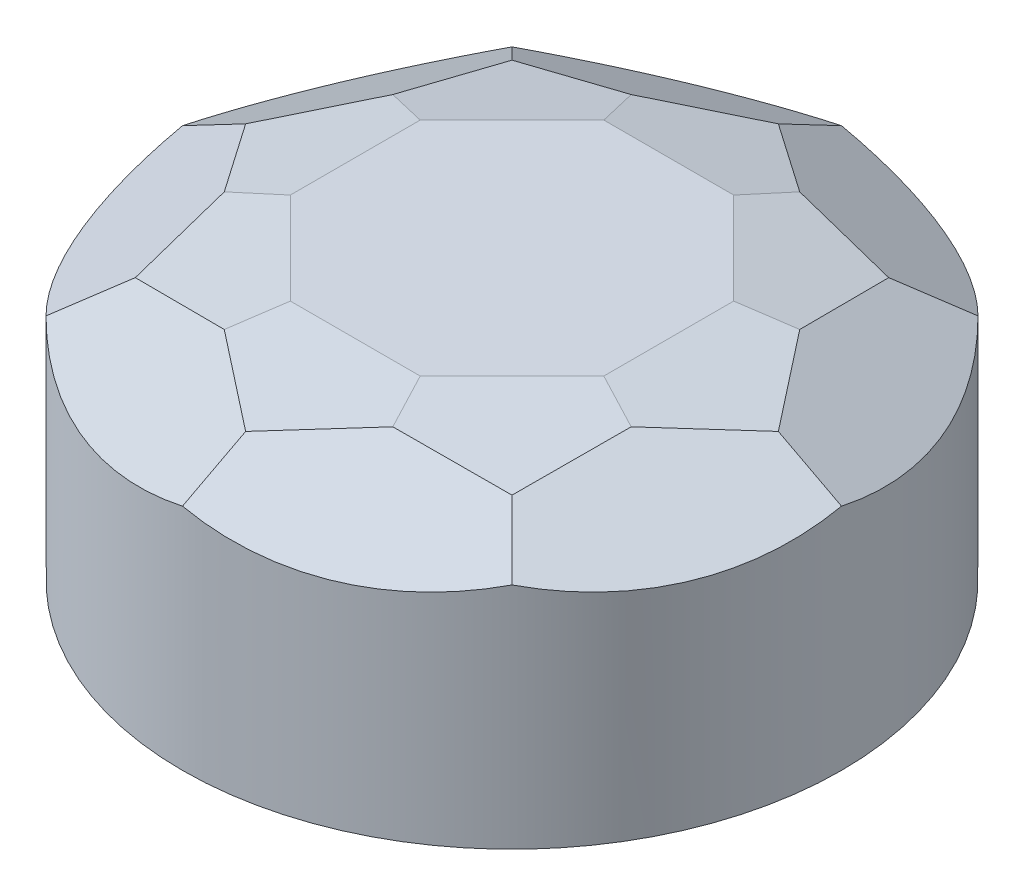
ISO-10303-21;
HEADER;
FILE_DESCRIPTION(('STEP AP214'),'2;1');
FILE_NAME('part.step','',(''),(''),'','','');
FILE_SCHEMA(('AUTOMOTIVE_DESIGN { 1 0 10303 214 1 1 1 1 }'));
ENDSEC;
DATA;
#1=APPLICATION_CONTEXT('core data for automotive mechanical design processes');
#2=APPLICATION_PROTOCOL_DEFINITION('international standard','automotive_design',2000,#1);
#3=PRODUCT_CONTEXT('',#1,'mechanical');
#4=PRODUCT('Part','Part','',(#3));
#5=PRODUCT_RELATED_PRODUCT_CATEGORY('part','',(#4));
#6=PRODUCT_DEFINITION_FORMATION('','',#4);
#7=PRODUCT_DEFINITION_CONTEXT('part definition',#1,'design');
#8=PRODUCT_DEFINITION('design','',#6,#7);
#9=PRODUCT_DEFINITION_SHAPE('','',#8);
#10=(LENGTH_UNIT() NAMED_UNIT(*) SI_UNIT(.MILLI.,.METRE.));
#11=(NAMED_UNIT(*) PLANE_ANGLE_UNIT() SI_UNIT($,.RADIAN.));
#12=(NAMED_UNIT(*) SI_UNIT($,.STERADIAN.) SOLID_ANGLE_UNIT());
#13=UNCERTAINTY_MEASURE_WITH_UNIT(LENGTH_MEASURE(1.E-05),#10,'distance_accuracy_value','');
#14=(GEOMETRIC_REPRESENTATION_CONTEXT(3) GLOBAL_UNCERTAINTY_ASSIGNED_CONTEXT((#13)) GLOBAL_UNIT_ASSIGNED_CONTEXT((#10,
#11,#12)) REPRESENTATION_CONTEXT('',''));
#15=CARTESIAN_POINT('',(0.,0.,0.));
#16=DIRECTION('',(0.,0.,1.));
#17=DIRECTION('',(1.,0.,0.));
#18=AXIS2_PLACEMENT_3D('',#15,#16,#17);
#19=CARTESIAN_POINT('',(2.55613981266696,2.5,0.));
#20=DIRECTION('',(-0.456405180558468,-0.869456557392768,0.189049215724658));
#21=DIRECTION('',(-0.382683432365089,0.,-0.923879532511287));
#22=AXIS2_PLACEMENT_3D('',#19,#20,#21);
#23=PLANE('',#22);
#24=CARTESIAN_POINT('',(0.,3.84179844043195,0.));
#25=DIRECTION('',(-0.456405180558468,-0.869456557392768,0.189049215724658));
#26=DIRECTION('',(0.803273117782904,-0.494009407609528,-0.332726619675399));
#27=AXIS2_PLACEMENT_3D('',#24,#25,#26);
#28=ELLIPSE('',#27,3.62295272054291,3.15);
#29=CARTESIAN_POINT('',(2.22738636073762,2.18826404985777,-2.22738636073763));
#30=VERTEX_POINT('',#29);
#31=CARTESIAN_POINT('',(3.15,2.18826404985777,0.));
#32=VERTEX_POINT('',#31);
#33=EDGE_CURVE('E106',#30,#32,#28,.T.);
#34=ORIENTED_EDGE('',*,*,#33,.F.);
#35=DIRECTION('',(0.626088497425685,-0.464786388336079,-0.626088497425685));
#36=VECTOR('',#35,1.);
#37=CARTESIAN_POINT('',(1.80746379519772,2.5,-1.80746379519772));
#38=LINE('',#37,#36);
#39=CARTESIAN_POINT('',(1.80055051986738,2.50513217585943,-1.80055051986739));
#40=VERTEX_POINT('',#39);
#41=EDGE_CURVE('E186',#40,#30,#38,.T.);
#42=ORIENTED_EDGE('',*,*,#41,.F.);
#43=DIRECTION('',(0.14228490267572,0.138416972490149,0.980099866440773));
#44=VECTOR('',#43,1.);
#45=CARTESIAN_POINT('',(2.05207874902967,2.74982276018517,-0.0679507909285371));
#46=LINE('',#45,#44);
#47=CARTESIAN_POINT('',(1.9449856260838,2.64564089988994,-0.805639424944661));
#48=VERTEX_POINT('',#47);
#49=EDGE_CURVE('E189',#40,#48,#46,.T.);
#50=ORIENTED_EDGE('',*,*,#49,.T.);
#51=DIRECTION('',(0.592424642257822,-0.138416972490143,0.793645881342778));
#52=VECTOR('',#51,1.);
#53=CARTESIAN_POINT('',(2.55119969783468,2.50400209807899,0.00647956359621975));
#54=LINE('',#53,#52);
#55=CARTESIAN_POINT('',(2.54636296493438,2.50513217585944,0.));
#56=VERTEX_POINT('',#55);
#57=EDGE_CURVE('E182',#48,#56,#54,.T.);
#58=ORIENTED_EDGE('',*,*,#57,.T.);
#59=DIRECTION('',(0.885422844305196,-0.464786388336079,0.));
#60=VECTOR('',#59,1.);
#61=CARTESIAN_POINT('',(2.55613981266696,2.5,0.));
#62=LINE('',#61,#60);
#63=EDGE_CURVE('E183',#32,#56,#62,.F.);
#64=ORIENTED_EDGE('',*,*,#63,.F.);
#65=EDGE_LOOP('',(#34,#42,#50,#58,#64));
#66=FACE_BOUND('',#65,.T.);
#67=ADVANCED_FACE('F34',(#66),#23,.F.);
#68=CARTESIAN_POINT('',(1.80746379519772,2.5,-1.80746379519772));
#69=DIRECTION('',(-0.189049215724659,-0.869456557392768,0.456405180558468));
#70=DIRECTION('',(-0.923879532511287,0.,-0.38268343236509));
#71=AXIS2_PLACEMENT_3D('',#68,#69,#70);
#72=PLANE('',#71);
#73=CARTESIAN_POINT('',(0.,3.84179844043195,0.));
#74=DIRECTION('',(-0.189049215724659,-0.869456557392768,0.456405180558468));
#75=DIRECTION('',(0.332726619675399,-0.494009407609527,-0.803273117782904));
#76=AXIS2_PLACEMENT_3D('',#73,#74,#75);
#77=ELLIPSE('',#76,3.62295272054291,3.15);
#78=CARTESIAN_POINT('',(0.,2.18826404985777,-3.15));
#79=VERTEX_POINT('',#78);
#80=EDGE_CURVE('E217',#79,#30,#77,.T.);
#81=ORIENTED_EDGE('',*,*,#80,.F.);
#82=DIRECTION('',(0.,-0.464786388336079,-0.885422844305196));
#83=VECTOR('',#82,1.);
#84=CARTESIAN_POINT('',(0.,2.5,-2.55613981266696));
#85=LINE('',#84,#83);
#86=CARTESIAN_POINT('',(0.,2.50513217585944,-2.54636296493438));
#87=VERTEX_POINT('',#86);
#88=EDGE_CURVE('E176',#87,#79,#85,.T.);
#89=ORIENTED_EDGE('',*,*,#88,.F.);
#90=DIRECTION('',(0.793645881342772,0.138416972490148,0.592424642257829));
#91=VECTOR('',#90,1.);
#92=CARTESIAN_POINT('',(1.40299033391513,2.74982276018517,-1.49908726402025));
#93=LINE('',#92,#91);
#94=CARTESIAN_POINT('',(0.80563942494462,2.64564089988994,-1.94498562608382));
#95=VERTEX_POINT('',#94);
#96=EDGE_CURVE('E197',#87,#95,#93,.T.);
#97=ORIENTED_EDGE('',*,*,#96,.T.);
#98=DIRECTION('',(0.980099866440773,-0.138416972490143,0.142284902675732));
#99=VECTOR('',#98,1.);
#100=CARTESIAN_POINT('',(1.80855234985799,2.50400209807899,-1.79938886314196));
#101=LINE('',#100,#99);
#102=EDGE_CURVE('E192',#95,#40,#101,.T.);
#103=ORIENTED_EDGE('',*,*,#102,.T.);
#104=ORIENTED_EDGE('',*,*,#41,.T.);
#105=EDGE_LOOP('',(#81,#89,#97,#103,#104));
#106=FACE_BOUND('',#105,.T.);
#107=ADVANCED_FACE('F330',(#106),#72,.F.);
#108=CARTESIAN_POINT('',(1.80746379519772,2.5,1.80746379519772));
#109=DIRECTION('',(-0.456405180558467,-0.869456557392768,-0.189049215724659));
#110=DIRECTION('',(0.38268343236509,0.,-0.923879532511287));
#111=AXIS2_PLACEMENT_3D('',#108,#109,#110);
#112=PLANE('',#111);
#113=CARTESIAN_POINT('',(0.,3.84179844043195,0.));
#114=DIRECTION('',(-0.456405180558467,-0.869456557392768,-0.189049215724659));
#115=DIRECTION('',(0.803273117782904,-0.494009407609527,0.332726619675399));
#116=AXIS2_PLACEMENT_3D('',#113,#114,#115);
#117=ELLIPSE('',#116,3.62295272054291,3.15);
#118=CARTESIAN_POINT('',(2.22738636073762,2.18826404985777,2.22738636073763));
#119=VERTEX_POINT('',#118);
#120=EDGE_CURVE('E220',#32,#119,#117,.T.);
#121=ORIENTED_EDGE('',*,*,#120,.F.);
#122=ORIENTED_EDGE('',*,*,#63,.T.);
#123=DIRECTION('',(-0.59242464225783,0.138416972490149,0.793645881342771));
#124=VECTOR('',#123,1.);
#125=CARTESIAN_POINT('',(1.49908726402025,2.74982276018517,1.40299033391513));
#126=LINE('',#125,#124);
#127=CARTESIAN_POINT('',(1.94498562608382,2.64564089988994,0.805639424944625));
#128=VERTEX_POINT('',#127);
#129=EDGE_CURVE('E179',#56,#128,#126,.T.);
#130=ORIENTED_EDGE('',*,*,#129,.T.);
#131=DIRECTION('',(-0.14228490267573,-0.138416972490144,0.980099866440773));
#132=VECTOR('',#131,1.);
#133=CARTESIAN_POINT('',(1.79938886314196,2.50400209807899,1.80855234985799));
#134=LINE('',#133,#132);
#135=CARTESIAN_POINT('',(1.80055051986738,2.50513217585944,1.80055051986738));
#136=VERTEX_POINT('',#135);
#137=EDGE_CURVE('E172',#128,#136,#134,.T.);
#138=ORIENTED_EDGE('',*,*,#137,.T.);
#139=DIRECTION('',(0.626088497425686,-0.464786388336079,0.626088497425684));
#140=VECTOR('',#139,1.);
#141=CARTESIAN_POINT('',(1.80746379519772,2.5,1.80746379519772));
#142=LINE('',#141,#140);
#143=EDGE_CURVE('E173',#119,#136,#142,.F.);
#144=ORIENTED_EDGE('',*,*,#143,.F.);
#145=EDGE_LOOP('',(#121,#122,#130,#138,#144));
#146=FACE_BOUND('',#145,.T.);
#147=ADVANCED_FACE('F254',(#146),#112,.F.);
#148=CARTESIAN_POINT('',(0.,2.5,-2.55613981266696));
#149=DIRECTION('',(0.189049215724659,-0.869456557392768,0.456405180558468));
#150=DIRECTION('',(-0.923879532511287,0.,0.382683432365089));
#151=AXIS2_PLACEMENT_3D('',#148,#149,#150);
#152=PLANE('',#151);
#153=CARTESIAN_POINT('',(0.,3.84179844043195,0.));
#154=DIRECTION('',(0.189049215724659,-0.869456557392768,0.456405180558468));
#155=DIRECTION('',(-0.332726619675399,-0.494009407609527,-0.803273117782903));
#156=AXIS2_PLACEMENT_3D('',#153,#154,#155);
#157=ELLIPSE('',#156,3.62295272054291,3.15);
#158=CARTESIAN_POINT('',(-2.22738636073763,2.18826404985777,-2.22738636073763));
#159=VERTEX_POINT('',#158);
#160=EDGE_CURVE('E223',#159,#79,#157,.T.);
#161=ORIENTED_EDGE('',*,*,#160,.F.);
#162=DIRECTION('',(-0.626088497425686,-0.464786388336079,-0.626088497425685));
#163=VECTOR('',#162,1.);
#164=CARTESIAN_POINT('',(-1.80746379519772,2.5,-1.80746379519772));
#165=LINE('',#164,#163);
#166=CARTESIAN_POINT('',(-1.80055051986738,2.50513217585943,-1.80055051986739));
#167=VERTEX_POINT('',#166);
#168=EDGE_CURVE('E167',#167,#159,#165,.T.);
#169=ORIENTED_EDGE('',*,*,#168,.F.);
#170=DIRECTION('',(0.980099866440773,0.138416972490147,-0.142284902675725));
#171=VECTOR('',#170,1.);
#172=CARTESIAN_POINT('',(-0.067950790928532,2.74982276018517,-2.05207874902968));
#173=LINE('',#172,#171);
#174=CARTESIAN_POINT('',(-0.805639424944643,2.64564089988994,-1.94498562608382));
#175=VERTEX_POINT('',#174);
#176=EDGE_CURVE('E205',#167,#175,#173,.T.);
#177=ORIENTED_EDGE('',*,*,#176,.T.);
#178=DIRECTION('',(0.793645881342776,-0.138416972490144,-0.592424642257824));
#179=VECTOR('',#178,1.);
#180=CARTESIAN_POINT('',(0.00647956359622009,2.50400209807899,-2.55119969783468));
#181=LINE('',#180,#179);
#182=EDGE_CURVE('E200',#175,#87,#181,.T.);
#183=ORIENTED_EDGE('',*,*,#182,.T.);
#184=ORIENTED_EDGE('',*,*,#88,.T.);
#185=EDGE_LOOP('',(#161,#169,#177,#183,#184));
#186=FACE_BOUND('',#185,.T.);
#187=ADVANCED_FACE('F341',(#186),#152,.F.);
#188=CARTESIAN_POINT('',(0.,2.5,2.55613981266696));
#189=DIRECTION('',(-0.189049215724658,-0.869456557392768,-0.456405180558468));
#190=DIRECTION('',(0.923879532511287,0.,-0.38268343236509));
#191=AXIS2_PLACEMENT_3D('',#188,#189,#190);
#192=PLANE('',#191);
#193=CARTESIAN_POINT('',(0.,3.84179844043195,0.));
#194=DIRECTION('',(-0.189049215724658,-0.869456557392768,-0.456405180558468));
#195=DIRECTION('',(0.332726619675399,-0.494009407609527,0.803273117782903));
#196=AXIS2_PLACEMENT_3D('',#193,#194,#195);
#197=ELLIPSE('',#196,3.62295272054291,3.15);
#198=CARTESIAN_POINT('',(0.,2.18826404985777,3.15));
#199=VERTEX_POINT('',#198);
#200=EDGE_CURVE('E226',#119,#199,#197,.T.);
#201=ORIENTED_EDGE('',*,*,#200,.F.);
#202=ORIENTED_EDGE('',*,*,#143,.T.);
#203=DIRECTION('',(-0.980099866440773,0.138416972490148,0.142284902675722));
#204=VECTOR('',#203,1.);
#205=CARTESIAN_POINT('',(0.0679507909285356,2.74982276018517,2.05207874902968));
#206=LINE('',#205,#204);
#207=CARTESIAN_POINT('',(0.805639424944655,2.64564089988994,1.94498562608381));
#208=VERTEX_POINT('',#207);
#209=EDGE_CURVE('E155',#136,#208,#206,.T.);
#210=ORIENTED_EDGE('',*,*,#209,.T.);
#211=DIRECTION('',(-0.793645881342776,-0.138416972490145,0.592424642257824));
#212=VECTOR('',#211,1.);
#213=CARTESIAN_POINT('',(-0.00647956359621847,2.50400209807899,2.55119969783468));
#214=LINE('',#213,#212);
#215=CARTESIAN_POINT('',(0.,2.50513217585943,2.54636296493438));
#216=VERTEX_POINT('',#215);
#217=EDGE_CURVE('E164',#208,#216,#214,.T.);
#218=ORIENTED_EDGE('',*,*,#217,.T.);
#219=DIRECTION('',(0.,-0.464786388336079,0.885422844305196));
#220=VECTOR('',#219,1.);
#221=CARTESIAN_POINT('',(0.,2.5,2.55613981266696));
#222=LINE('',#221,#220);
#223=EDGE_CURVE('E165',#199,#216,#222,.F.);
#224=ORIENTED_EDGE('',*,*,#223,.F.);
#225=EDGE_LOOP('',(#201,#202,#210,#218,#224));
#226=FACE_BOUND('',#225,.T.);
#227=ADVANCED_FACE('F279',(#226),#192,.F.);
#228=CARTESIAN_POINT('',(-1.80746379519772,2.5,-1.80746379519772));
#229=DIRECTION('',(0.456405180558468,-0.869456557392768,0.189049215724658));
#230=DIRECTION('',(-0.38268343236509,0.,0.923879532511287));
#231=AXIS2_PLACEMENT_3D('',#228,#229,#230);
#232=PLANE('',#231);
#233=CARTESIAN_POINT('',(0.,3.84179844043195,0.));
#234=DIRECTION('',(0.456405180558468,-0.869456557392768,0.189049215724658));
#235=DIRECTION('',(-0.803273117782904,-0.494009407609527,-0.332726619675399));
#236=AXIS2_PLACEMENT_3D('',#233,#234,#235);
#237=ELLIPSE('',#236,3.62295272054291,3.15);
#238=CARTESIAN_POINT('',(-3.15,2.18826404985777,0.));
#239=VERTEX_POINT('',#238);
#240=EDGE_CURVE('E228',#239,#159,#237,.T.);
#241=ORIENTED_EDGE('',*,*,#240,.F.);
#242=DIRECTION('',(-0.885422844305196,-0.464786388336079,0.));
#243=VECTOR('',#242,1.);
#244=CARTESIAN_POINT('',(-2.55613981266696,2.5,0.));
#245=LINE('',#244,#243);
#246=CARTESIAN_POINT('',(-2.54636296493438,2.50513217585943,0.));
#247=VERTEX_POINT('',#246);
#248=EDGE_CURVE('E159',#247,#239,#245,.T.);
#249=ORIENTED_EDGE('',*,*,#248,.F.);
#250=DIRECTION('',(0.592424642257827,0.138416972490147,-0.793645881342773));
#251=VECTOR('',#250,1.);
#252=CARTESIAN_POINT('',(-1.49908726402025,2.74982276018517,-1.40299033391514));
#253=LINE('',#252,#251);
#254=CARTESIAN_POINT('',(-1.94498562608382,2.64564089988994,-0.805639424944638));
#255=VERTEX_POINT('',#254);
#256=EDGE_CURVE('E154',#247,#255,#253,.T.);
#257=ORIENTED_EDGE('',*,*,#256,.T.);
#258=DIRECTION('',(0.142284902675726,-0.138416972490146,-0.980099866440773));
#259=VECTOR('',#258,1.);
#260=CARTESIAN_POINT('',(-1.79938886314196,2.50400209807899,-1.80855234985799));
#261=LINE('',#260,#259);
#262=EDGE_CURVE('E102',#255,#167,#261,.T.);
#263=ORIENTED_EDGE('',*,*,#262,.T.);
#264=ORIENTED_EDGE('',*,*,#168,.T.);
#265=EDGE_LOOP('',(#241,#249,#257,#263,#264));
#266=FACE_BOUND('',#265,.T.);
#267=ADVANCED_FACE('F309',(#266),#232,.F.);
#268=CARTESIAN_POINT('',(-1.80746379519772,2.5,1.80746379519772));
#269=DIRECTION('',(0.189049215724659,-0.869456557392768,-0.456405180558468));
#270=DIRECTION('',(0.923879532511287,0.,0.38268343236509));
#271=AXIS2_PLACEMENT_3D('',#268,#269,#270);
#272=PLANE('',#271);
#273=CARTESIAN_POINT('',(0.,3.84179844043195,0.));
#274=DIRECTION('',(0.189049215724659,-0.869456557392768,-0.456405180558468));
#275=DIRECTION('',(-0.332726619675399,-0.494009407609527,0.803273117782903));
#276=AXIS2_PLACEMENT_3D('',#273,#274,#275);
#277=ELLIPSE('',#276,3.62295272054291,3.15);
#278=CARTESIAN_POINT('',(-2.22738636073763,2.18826404985777,2.22738636073762));
#279=VERTEX_POINT('',#278);
#280=EDGE_CURVE('E48',#199,#279,#277,.T.);
#281=ORIENTED_EDGE('',*,*,#280,.F.);
#282=ORIENTED_EDGE('',*,*,#223,.T.);
#283=DIRECTION('',(-0.793645881342772,0.138416972490148,-0.592424642257829));
#284=VECTOR('',#283,1.);
#285=CARTESIAN_POINT('',(-1.40299033391514,2.74982276018517,1.49908726402025));
#286=LINE('',#285,#284);
#287=CARTESIAN_POINT('',(-0.805639424944632,2.64564089988994,1.94498562608382));
#288=VERTEX_POINT('',#287);
#289=EDGE_CURVE('E161',#216,#288,#286,.T.);
#290=ORIENTED_EDGE('',*,*,#289,.T.);
#291=DIRECTION('',(-0.980099866440773,-0.138416972490145,-0.142284902675729));
#292=VECTOR('',#291,1.);
#293=CARTESIAN_POINT('',(-1.80855234985799,2.50400209807899,1.79938886314196));
#294=LINE('',#293,#292);
#295=CARTESIAN_POINT('',(-1.80055051986738,2.50513217585944,1.80055051986738));
#296=VERTEX_POINT('',#295);
#297=EDGE_CURVE('E157',#288,#296,#294,.T.);
#298=ORIENTED_EDGE('',*,*,#297,.T.);
#299=DIRECTION('',(0.626088497425685,0.464786388336079,-0.626088497425685));
#300=VECTOR('',#299,1.);
#301=CARTESIAN_POINT('',(-1.55563678964256,2.68694763580346,1.55563678964256));
#302=LINE('',#301,#300);
#303=EDGE_CURVE('E56',#279,#296,#302,.T.);
#304=ORIENTED_EDGE('',*,*,#303,.F.);
#305=EDGE_LOOP('',(#281,#282,#290,#298,#304));
#306=FACE_BOUND('',#305,.T.);
#307=ADVANCED_FACE('F320',(#306),#272,.F.);
#308=CARTESIAN_POINT('',(-2.55613981266696,2.5,0.));
#309=DIRECTION('',(0.456405180558468,-0.869456557392768,-0.189049215724659));
#310=DIRECTION('',(0.38268343236509,0.,0.923879532511287));
#311=AXIS2_PLACEMENT_3D('',#308,#309,#310);
#312=PLANE('',#311);
#313=CARTESIAN_POINT('',(0.,3.84179844043195,0.));
#314=DIRECTION('',(0.456405180558468,-0.869456557392768,-0.189049215724659));
#315=DIRECTION('',(-0.803273117782903,-0.494009407609527,0.332726619675399));
#316=AXIS2_PLACEMENT_3D('',#313,#314,#315);
#317=ELLIPSE('',#316,3.62295272054291,3.15);
#318=EDGE_CURVE('E11',#279,#239,#317,.T.);
#319=ORIENTED_EDGE('',*,*,#318,.F.);
#320=ORIENTED_EDGE('',*,*,#303,.T.);
#321=DIRECTION('',(-0.142284902675724,0.138416972490147,-0.980099866440773));
#322=VECTOR('',#321,1.);
#323=CARTESIAN_POINT('',(-2.05207874902968,2.74982276018517,0.0679507909285343));
#324=LINE('',#323,#322);
#325=CARTESIAN_POINT('',(-1.94498562608381,2.64564089988994,0.805639424944648));
#326=VERTEX_POINT('',#325);
#327=EDGE_CURVE('E42',#296,#326,#324,.T.);
#328=ORIENTED_EDGE('',*,*,#327,.T.);
#329=DIRECTION('',(-0.592424642257825,-0.138416972490145,-0.793645881342775));
#330=VECTOR('',#329,1.);
#331=CARTESIAN_POINT('',(-2.55119969783468,2.50400209807899,-0.00647956359621741));
#332=LINE('',#331,#330);
#333=EDGE_CURVE('E151',#326,#247,#332,.T.);
#334=ORIENTED_EDGE('',*,*,#333,.T.);
#335=ORIENTED_EDGE('',*,*,#248,.T.);
#336=EDGE_LOOP('',(#319,#320,#328,#334,#335));
#337=FACE_BOUND('',#336,.T.);
#338=ADVANCED_FACE('F310',(#337),#312,.F.);
#339=CARTESIAN_POINT('',(0.,2.75,0.));
#340=DIRECTION('',(0.,1.,0.));
#341=DIRECTION('',(0.,0.,1.));
#342=AXIS2_PLACEMENT_3D('',#339,#340,#341);
#343=PLANE('',#342);
#344=DIRECTION('',(-1.,0.,0.));
#345=VECTOR('',#344,1.);
#346=CARTESIAN_POINT('',(0.620628059159733,2.75,-1.49832867761277));
#347=LINE('',#346,#345);
#348=CARTESIAN_POINT('',(0.620628059159733,2.75,-1.49832867761277));
#349=VERTEX_POINT('',#348);
#350=CARTESIAN_POINT('',(-0.620628059159751,2.75,-1.49832867761276));
#351=VERTEX_POINT('',#350);
#352=EDGE_CURVE('E119',#349,#351,#347,.T.);
#353=ORIENTED_EDGE('',*,*,#352,.T.);
#354=DIRECTION('',(-0.707106781186547,0.,0.707106781186548));
#355=VECTOR('',#354,1.);
#356=CARTESIAN_POINT('',(-0.620628059159751,2.75,-1.49832867761276));
#357=LINE('',#356,#355);
#358=CARTESIAN_POINT('',(-1.49832867761276,2.75,-0.620628059159749));
#359=VERTEX_POINT('',#358);
#360=EDGE_CURVE('E99',#351,#359,#357,.T.);
#361=ORIENTED_EDGE('',*,*,#360,.T.);
#362=DIRECTION('',(0.,0.,1.));
#363=VECTOR('',#362,1.);
#364=CARTESIAN_POINT('',(-1.49832867761276,2.75,-0.620628059159749));
#365=LINE('',#364,#363);
#366=CARTESIAN_POINT('',(-1.49832867761276,2.75,0.620628059159756));
#367=VERTEX_POINT('',#366);
#368=EDGE_CURVE('E108',#359,#367,#365,.T.);
#369=ORIENTED_EDGE('',*,*,#368,.T.);
#370=DIRECTION('',(0.70710678118655,0.,0.707106781186545));
#371=VECTOR('',#370,1.);
#372=CARTESIAN_POINT('',(-1.49832867761276,2.75,0.620628059159756));
#373=LINE('',#372,#371);
#374=CARTESIAN_POINT('',(-0.620628059159744,2.75,1.49832867761277));
#375=VERTEX_POINT('',#374);
#376=EDGE_CURVE('E115',#367,#375,#373,.T.);
#377=ORIENTED_EDGE('',*,*,#376,.T.);
#378=DIRECTION('',(1.,0.,0.));
#379=VECTOR('',#378,1.);
#380=CARTESIAN_POINT('',(-0.620628059159744,2.75,1.49832867761277));
#381=LINE('',#380,#379);
#382=CARTESIAN_POINT('',(0.620628059159761,2.75,1.49832867761276));
#383=VERTEX_POINT('',#382);
#384=EDGE_CURVE('E126',#375,#383,#381,.T.);
#385=ORIENTED_EDGE('',*,*,#384,.T.);
#386=DIRECTION('',(0.707106781186542,0.,-0.707106781186553));
#387=VECTOR('',#386,1.);
#388=CARTESIAN_POINT('',(0.620628059159761,2.75,1.49832867761276));
#389=LINE('',#388,#387);
#390=CARTESIAN_POINT('',(1.49832867761277,2.75,0.620628059159739));
#391=VERTEX_POINT('',#390);
#392=EDGE_CURVE('E128',#383,#391,#389,.T.);
#393=ORIENTED_EDGE('',*,*,#392,.T.);
#394=DIRECTION('',(0.,0.,-1.));
#395=VECTOR('',#394,1.);
#396=CARTESIAN_POINT('',(1.49832867761277,2.75,0.620628059159739));
#397=LINE('',#396,#395);
#398=CARTESIAN_POINT('',(1.49832867761276,2.75,-0.620628059159767));
#399=VERTEX_POINT('',#398);
#400=EDGE_CURVE('E130',#391,#399,#397,.T.);
#401=ORIENTED_EDGE('',*,*,#400,.T.);
#402=DIRECTION('',(-0.707106781186555,0.,-0.70710678118654));
#403=VECTOR('',#402,1.);
#404=CARTESIAN_POINT('',(1.49832867761276,2.75,-0.620628059159767));
#405=LINE('',#404,#403);
#406=EDGE_CURVE('E132',#399,#349,#405,.T.);
#407=ORIENTED_EDGE('',*,*,#406,.T.);
#408=EDGE_LOOP('',(#353,#361,#369,#377,#385,#393,#401,#407));
#409=FACE_BOUND('',#408,.T.);
#410=ADVANCED_FACE('F117',(#409),#343,.T.);
#411=CARTESIAN_POINT('',(0.620628059159761,2.75,1.49832867761276));
#412=DIRECTION('',(-0.160879024817218,-0.973774038854868,-0.160879024817216));
#413=DIRECTION('',(0.707106781186542,0.,-0.707106781186553));
#414=AXIS2_PLACEMENT_3D('',#411,#412,#413);
#415=PLANE('',#414);
#416=ORIENTED_EDGE('',*,*,#209,.F.);
#417=ORIENTED_EDGE('',*,*,#137,.F.);
#418=DIRECTION('',(0.903079393589205,-0.210999858315234,0.37406773272431));
#419=VECTOR('',#418,1.);
#420=CARTESIAN_POINT('',(1.49832867761277,2.75,0.620628059159739));
#421=LINE('',#420,#419);
#422=EDGE_CURVE('E122',#391,#128,#421,.T.);
#423=ORIENTED_EDGE('',*,*,#422,.F.);
#424=ORIENTED_EDGE('',*,*,#392,.F.);
#425=DIRECTION('',(0.374067732724324,-0.210999858315234,0.903079393589199));
#426=VECTOR('',#425,1.);
#427=CARTESIAN_POINT('',(0.620628059159761,2.75,1.49832867761276));
#428=LINE('',#427,#426);
#429=EDGE_CURVE('E136',#208,#383,#428,.F.);
#430=ORIENTED_EDGE('',*,*,#429,.F.);
#431=EDGE_LOOP('',(#416,#417,#423,#424,#430));
#432=FACE_BOUND('',#431,.T.);
#433=ADVANCED_FACE('F273',(#432),#415,.F.);
#434=CARTESIAN_POINT('',(1.49832867761277,2.75,0.620628059159739));
#435=DIRECTION('',(-0.227517298797866,-0.973774038854868,0.));
#436=DIRECTION('',(0.,0.,-1.));
#437=AXIS2_PLACEMENT_3D('',#434,#435,#436);
#438=PLANE('',#437);
#439=ORIENTED_EDGE('',*,*,#129,.F.);
#440=ORIENTED_EDGE('',*,*,#57,.F.);
#441=DIRECTION('',(0.903079393589198,-0.210999858315234,-0.374067732724327));
#442=VECTOR('',#441,1.);
#443=CARTESIAN_POINT('',(1.49832867761276,2.75,-0.620628059159767));
#444=LINE('',#443,#442);
#445=EDGE_CURVE('E139',#399,#48,#444,.T.);
#446=ORIENTED_EDGE('',*,*,#445,.F.);
#447=ORIENTED_EDGE('',*,*,#400,.F.);
#448=ORIENTED_EDGE('',*,*,#422,.T.);
#449=EDGE_LOOP('',(#439,#440,#446,#447,#448));
#450=FACE_BOUND('',#449,.T.);
#451=ADVANCED_FACE('F265',(#450),#438,.F.);
#452=CARTESIAN_POINT('',(-0.620628059159744,2.75,1.49832867761277));
#453=DIRECTION('',(0.,-0.973774038854868,-0.227517298797866));
#454=DIRECTION('',(1.,0.,0.));
#455=AXIS2_PLACEMENT_3D('',#452,#453,#454);
#456=PLANE('',#455);
#457=ORIENTED_EDGE('',*,*,#429,.T.);
#458=ORIENTED_EDGE('',*,*,#384,.F.);
#459=DIRECTION('',(-0.374067732724314,-0.210999858315234,0.903079393589203));
#460=VECTOR('',#459,1.);
#461=CARTESIAN_POINT('',(-0.620628059159744,2.75,1.49832867761277));
#462=LINE('',#461,#460);
#463=EDGE_CURVE('E142',#288,#375,#462,.F.);
#464=ORIENTED_EDGE('',*,*,#463,.F.);
#465=ORIENTED_EDGE('',*,*,#289,.F.);
#466=ORIENTED_EDGE('',*,*,#217,.F.);
#467=EDGE_LOOP('',(#457,#458,#464,#465,#466));
#468=FACE_BOUND('',#467,.T.);
#469=ADVANCED_FACE('F318',(#468),#456,.F.);
#470=CARTESIAN_POINT('',(1.49832867761276,2.75,-0.620628059159767));
#471=DIRECTION('',(-0.160879024817215,-0.973774038854868,0.160879024817219));
#472=DIRECTION('',(-0.707106781186555,0.,-0.70710678118654));
#473=AXIS2_PLACEMENT_3D('',#470,#471,#472);
#474=PLANE('',#473);
#475=ORIENTED_EDGE('',*,*,#49,.F.);
#476=ORIENTED_EDGE('',*,*,#102,.F.);
#477=DIRECTION('',(0.37406773272431,-0.210999858315234,-0.903079393589204));
#478=VECTOR('',#477,1.);
#479=CARTESIAN_POINT('',(0.620628059159733,2.75,-1.49832867761277));
#480=LINE('',#479,#478);
#481=EDGE_CURVE('E143',#349,#95,#480,.T.);
#482=ORIENTED_EDGE('',*,*,#481,.F.);
#483=ORIENTED_EDGE('',*,*,#406,.F.);
#484=ORIENTED_EDGE('',*,*,#445,.T.);
#485=EDGE_LOOP('',(#475,#476,#482,#483,#484));
#486=FACE_BOUND('',#485,.T.);
#487=ADVANCED_FACE('F433',(#486),#474,.F.);
#488=CARTESIAN_POINT('',(-1.49832867761276,2.75,0.620628059159756));
#489=DIRECTION('',(0.160879024817216,-0.973774038854868,-0.160879024817218));
#490=DIRECTION('',(0.70710678118655,0.,0.707106781186545));
#491=AXIS2_PLACEMENT_3D('',#488,#489,#490);
#492=PLANE('',#491);
#493=ORIENTED_EDGE('',*,*,#463,.T.);
#494=ORIENTED_EDGE('',*,*,#376,.F.);
#495=DIRECTION('',(0.9030793935892,0.210999858315234,-0.374067732724321));
#496=VECTOR('',#495,1.);
#497=CARTESIAN_POINT('',(-1.12842215525811,2.8364267575595,0.467407760790193));
#498=LINE('',#497,#496);
#499=EDGE_CURVE('E112',#326,#367,#498,.T.);
#500=ORIENTED_EDGE('',*,*,#499,.F.);
#501=ORIENTED_EDGE('',*,*,#327,.F.);
#502=ORIENTED_EDGE('',*,*,#297,.F.);
#503=EDGE_LOOP('',(#493,#494,#500,#501,#502));
#504=FACE_BOUND('',#503,.T.);
#505=ADVANCED_FACE('F314',(#504),#492,.F.);
#506=CARTESIAN_POINT('',(0.620628059159733,2.75,-1.49832867761277));
#507=DIRECTION('',(0.,-0.973774038854868,0.227517298797866));
#508=DIRECTION('',(-1.,0.,0.));
#509=AXIS2_PLACEMENT_3D('',#506,#507,#508);
#510=PLANE('',#509);
#511=ORIENTED_EDGE('',*,*,#96,.F.);
#512=ORIENTED_EDGE('',*,*,#182,.F.);
#513=DIRECTION('',(-0.37406773272432,-0.210999858315234,-0.9030793935892));
#514=VECTOR('',#513,1.);
#515=CARTESIAN_POINT('',(-0.620628059159751,2.75,-1.49832867761276));
#516=LINE('',#515,#514);
#517=EDGE_CURVE('E105',#351,#175,#516,.T.);
#518=ORIENTED_EDGE('',*,*,#517,.F.);
#519=ORIENTED_EDGE('',*,*,#352,.F.);
#520=ORIENTED_EDGE('',*,*,#481,.T.);
#521=EDGE_LOOP('',(#511,#512,#518,#519,#520));
#522=FACE_BOUND('',#521,.T.);
#523=ADVANCED_FACE('F416',(#522),#510,.F.);
#524=CARTESIAN_POINT('',(-1.49832867761276,2.75,-0.620628059159749));
#525=DIRECTION('',(0.227517298797866,-0.973774038854868,0.));
#526=DIRECTION('',(0.,0.,1.));
#527=AXIS2_PLACEMENT_3D('',#524,#525,#526);
#528=PLANE('',#527);
#529=ORIENTED_EDGE('',*,*,#499,.T.);
#530=ORIENTED_EDGE('',*,*,#368,.F.);
#531=DIRECTION('',(0.903079393589203,0.210999858315234,0.374067732724315));
#532=VECTOR('',#531,1.);
#533=CARTESIAN_POINT('',(-1.12842215525812,2.8364267575595,-0.467407760790188));
#534=LINE('',#533,#532);
#535=EDGE_CURVE('E95',#255,#359,#534,.T.);
#536=ORIENTED_EDGE('',*,*,#535,.F.);
#537=ORIENTED_EDGE('',*,*,#256,.F.);
#538=ORIENTED_EDGE('',*,*,#333,.F.);
#539=EDGE_LOOP('',(#529,#530,#536,#537,#538));
#540=FACE_BOUND('',#539,.T.);
#541=ADVANCED_FACE('F109',(#540),#528,.F.);
#542=CARTESIAN_POINT('',(-0.620628059159751,2.75,-1.49832867761276));
#543=DIRECTION('',(0.160879024817217,-0.973774038854868,0.160879024817217));
#544=DIRECTION('',(-0.707106781186547,0.,0.707106781186548));
#545=AXIS2_PLACEMENT_3D('',#542,#543,#544);
#546=PLANE('',#545);
#547=ORIENTED_EDGE('',*,*,#517,.T.);
#548=ORIENTED_EDGE('',*,*,#176,.F.);
#549=ORIENTED_EDGE('',*,*,#262,.F.);
#550=ORIENTED_EDGE('',*,*,#535,.T.);
#551=ORIENTED_EDGE('',*,*,#360,.F.);
#552=EDGE_LOOP('',(#547,#548,#549,#550,#551));
#553=FACE_BOUND('',#552,.T.);
#554=ADVANCED_FACE('F36',(#553),#546,.F.);
#555=CARTESIAN_POINT('',(0.,2.75,0.));
#556=DIRECTION('',(0.,-1.,0.));
#557=DIRECTION('',(0.,0.,-1.));
#558=AXIS2_PLACEMENT_3D('',#555,#556,#557);
#559=CYLINDRICAL_SURFACE('',#558,3.15);
#560=CARTESIAN_POINT('',(0.,0.,0.));
#561=DIRECTION('',(0.,-1.,0.));
#562=DIRECTION('',(0.,0.,-1.));
#563=AXIS2_PLACEMENT_3D('',#560,#561,#562);
#564=CIRCLE('',#563,3.15);
#565=CARTESIAN_POINT('',(0.,0.,-3.15));
#566=VERTEX_POINT('',#565);
#567=EDGE_CURVE('E232',#566,#566,#564,.T.);
#568=ORIENTED_EDGE('',*,*,#567,.F.);
#569=EDGE_LOOP('',(#568));
#570=FACE_BOUND('',#569,.T.);
#571=ORIENTED_EDGE('',*,*,#33,.T.);
#572=ORIENTED_EDGE('',*,*,#120,.T.);
#573=ORIENTED_EDGE('',*,*,#200,.T.);
#574=ORIENTED_EDGE('',*,*,#280,.T.);
#575=ORIENTED_EDGE('',*,*,#318,.T.);
#576=ORIENTED_EDGE('',*,*,#240,.T.);
#577=ORIENTED_EDGE('',*,*,#160,.T.);
#578=ORIENTED_EDGE('',*,*,#80,.T.);
#579=EDGE_LOOP('',(#571,#572,#573,#574,#575,#576,#577,#578));
#580=FACE_BOUND('',#579,.T.);
#581=ADVANCED_FACE('F238',(#570,#580),#559,.T.);
#582=CARTESIAN_POINT('',(0.,0.,0.));
#583=DIRECTION('',(0.,1.,0.));
#584=DIRECTION('',(0.,0.,1.));
#585=AXIS2_PLACEMENT_3D('',#582,#583,#584);
#586=PLANE('',#585);
#587=ORIENTED_EDGE('',*,*,#567,.T.);
#588=EDGE_LOOP('',(#587));
#589=FACE_BOUND('',#588,.T.);
#590=ADVANCED_FACE('F236',(#589),#586,.F.);
#591=CLOSED_SHELL('',(#67,#107,#147,#187,#227,#267,#307,#338,#410,#433,#451,#469,#487,#505,#523,
#541,#554,#581,#590));
#592=MANIFOLD_SOLID_BREP('B2',#591);
#593=ADVANCED_BREP_SHAPE_REPRESENTATION('',(#18,#592),#14);
#594=SHAPE_DEFINITION_REPRESENTATION(#9,#593);
ENDSEC;
END-ISO-10303-21;
